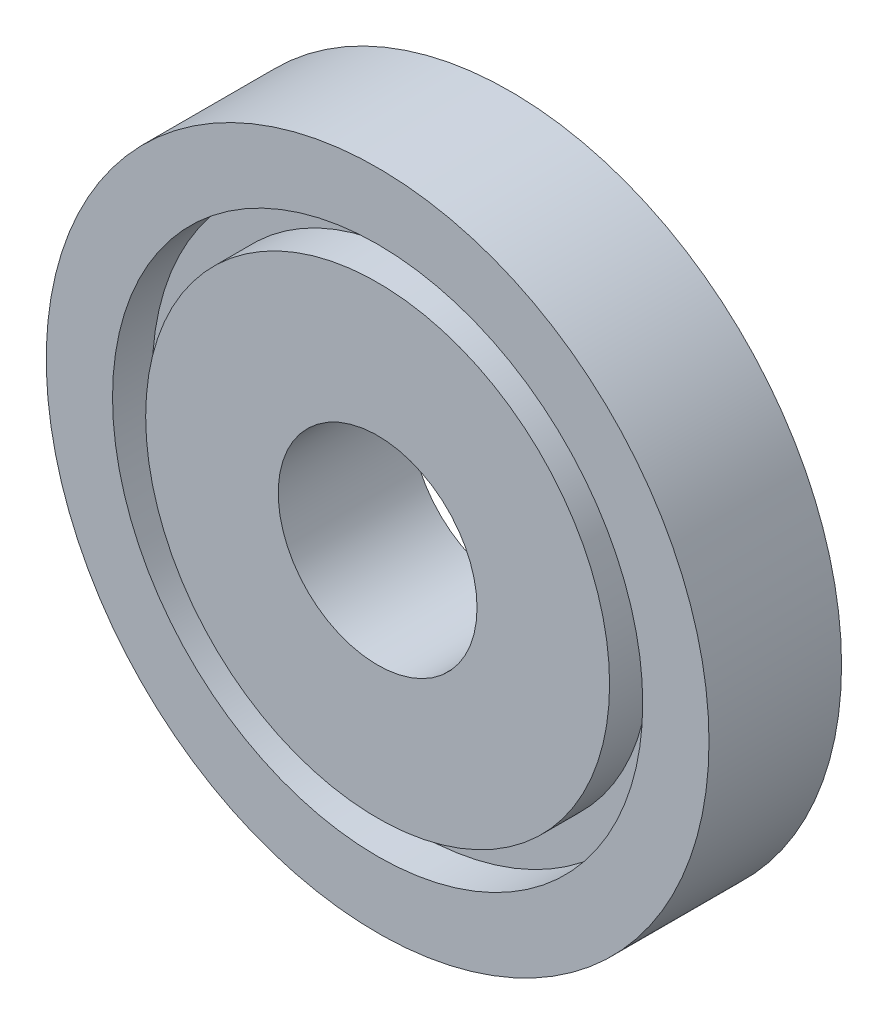
ISO-10303-21;
HEADER;
FILE_DESCRIPTION(('STEP AP214'),'2;1');
FILE_NAME('part.step','',(''),(''),'','','');
FILE_SCHEMA(('AUTOMOTIVE_DESIGN { 1 0 10303 214 1 1 1 1 }'));
ENDSEC;
DATA;
#1=APPLICATION_CONTEXT('core data for automotive mechanical design processes');
#2=APPLICATION_PROTOCOL_DEFINITION('international standard','automotive_design',2000,#1);
#3=PRODUCT_CONTEXT('',#1,'mechanical');
#4=PRODUCT('Part','Part','',(#3));
#5=PRODUCT_RELATED_PRODUCT_CATEGORY('part','',(#4));
#6=PRODUCT_DEFINITION_FORMATION('','',#4);
#7=PRODUCT_DEFINITION_CONTEXT('part definition',#1,'design');
#8=PRODUCT_DEFINITION('design','',#6,#7);
#9=PRODUCT_DEFINITION_SHAPE('','',#8);
#10=(LENGTH_UNIT() NAMED_UNIT(*) SI_UNIT(.MILLI.,.METRE.));
#11=(NAMED_UNIT(*) PLANE_ANGLE_UNIT() SI_UNIT($,.RADIAN.));
#12=(NAMED_UNIT(*) SI_UNIT($,.STERADIAN.) SOLID_ANGLE_UNIT());
#13=UNCERTAINTY_MEASURE_WITH_UNIT(LENGTH_MEASURE(1.E-05),#10,'distance_accuracy_value','');
#14=(GEOMETRIC_REPRESENTATION_CONTEXT(3) GLOBAL_UNCERTAINTY_ASSIGNED_CONTEXT((#13)) GLOBAL_UNIT_ASSIGNED_CONTEXT((#10,
#11,#12)) REPRESENTATION_CONTEXT('',''));
#15=CARTESIAN_POINT('',(0.,0.,0.));
#16=DIRECTION('',(0.,0.,1.));
#17=DIRECTION('',(1.,0.,0.));
#18=AXIS2_PLACEMENT_3D('',#15,#16,#17);
#19=CARTESIAN_POINT('',(0.,0.,-10.));
#20=DIRECTION('',(0.,0.,1.));
#21=DIRECTION('',(1.,0.,0.));
#22=AXIS2_PLACEMENT_3D('',#19,#20,#21);
#23=PLANE('',#22);
#24=CARTESIAN_POINT('',(0.,0.,-10.));
#25=DIRECTION('',(0.,0.,1.));
#26=DIRECTION('',(1.,0.,0.));
#27=AXIS2_PLACEMENT_3D('',#24,#25,#26);
#28=CIRCLE('',#27,15.);
#29=CARTESIAN_POINT('',(15.,0.,-10.));
#30=VERTEX_POINT('',#29);
#31=EDGE_CURVE('E46',#30,#30,#28,.T.);
#32=ORIENTED_EDGE('',*,*,#31,.T.);
#33=EDGE_LOOP('',(#32));
#34=FACE_BOUND('',#33,.T.);
#35=CARTESIAN_POINT('',(0.,0.,-10.));
#36=DIRECTION('',(0.,0.,1.));
#37=DIRECTION('',(1.,0.,0.));
#38=AXIS2_PLACEMENT_3D('',#35,#36,#37);
#39=CIRCLE('',#38,35.);
#40=CARTESIAN_POINT('',(35.,0.,-10.));
#41=VERTEX_POINT('',#40);
#42=EDGE_CURVE('E72',#41,#41,#39,.T.);
#43=ORIENTED_EDGE('',*,*,#42,.F.);
#44=EDGE_LOOP('',(#43));
#45=FACE_BOUND('',#44,.T.);
#46=ADVANCED_FACE('F35',(#34,#45),#23,.F.);
#47=CARTESIAN_POINT('',(0.,0.,10.));
#48=DIRECTION('',(0.,0.,1.));
#49=DIRECTION('',(1.,0.,0.));
#50=AXIS2_PLACEMENT_3D('',#47,#48,#49);
#51=PLANE('',#50);
#52=CARTESIAN_POINT('',(0.,0.,10.));
#53=DIRECTION('',(0.,0.,1.));
#54=DIRECTION('',(1.,0.,0.));
#55=AXIS2_PLACEMENT_3D('',#52,#53,#54);
#56=CIRCLE('',#55,15.);
#57=CARTESIAN_POINT('',(15.,0.,10.));
#58=VERTEX_POINT('',#57);
#59=EDGE_CURVE('E48',#58,#58,#56,.T.);
#60=ORIENTED_EDGE('',*,*,#59,.F.);
#61=EDGE_LOOP('',(#60));
#62=FACE_BOUND('',#61,.T.);
#63=CARTESIAN_POINT('',(0.,0.,10.));
#64=DIRECTION('',(0.,0.,1.));
#65=DIRECTION('',(1.,0.,0.));
#66=AXIS2_PLACEMENT_3D('',#63,#64,#65);
#67=CIRCLE('',#66,35.);
#68=CARTESIAN_POINT('',(35.,0.,10.));
#69=VERTEX_POINT('',#68);
#70=EDGE_CURVE('E60',#69,#69,#67,.T.);
#71=ORIENTED_EDGE('',*,*,#70,.T.);
#72=EDGE_LOOP('',(#71));
#73=FACE_BOUND('',#72,.T.);
#74=ADVANCED_FACE('F88',(#62,#73),#51,.T.);
#75=CARTESIAN_POINT('',(0.,0.,10.));
#76=DIRECTION('',(0.,0.,-1.));
#77=DIRECTION('',(-1.,0.,0.));
#78=AXIS2_PLACEMENT_3D('',#75,#76,#77);
#79=CYLINDRICAL_SURFACE('',#78,50.);
#80=CARTESIAN_POINT('',(0.,0.,10.));
#81=DIRECTION('',(0.,0.,1.));
#82=DIRECTION('',(1.,0.,0.));
#83=AXIS2_PLACEMENT_3D('',#80,#81,#82);
#84=CIRCLE('',#83,50.);
#85=CARTESIAN_POINT('',(50.,0.,10.));
#86=VERTEX_POINT('',#85);
#87=EDGE_CURVE('E10',#86,#86,#84,.T.);
#88=ORIENTED_EDGE('',*,*,#87,.F.);
#89=EDGE_LOOP('',(#88));
#90=FACE_BOUND('',#89,.T.);
#91=CARTESIAN_POINT('',(0.,0.,-10.));
#92=DIRECTION('',(0.,0.,1.));
#93=DIRECTION('',(1.,0.,0.));
#94=AXIS2_PLACEMENT_3D('',#91,#92,#93);
#95=CIRCLE('',#94,50.);
#96=CARTESIAN_POINT('',(50.,0.,-10.));
#97=VERTEX_POINT('',#96);
#98=EDGE_CURVE('E39',#97,#97,#95,.T.);
#99=ORIENTED_EDGE('',*,*,#98,.T.);
#100=EDGE_LOOP('',(#99));
#101=FACE_BOUND('',#100,.T.);
#102=ADVANCED_FACE('F37',(#90,#101),#79,.T.);
#103=CARTESIAN_POINT('',(0.,0.,10.));
#104=DIRECTION('',(0.,0.,1.));
#105=DIRECTION('',(1.,0.,0.));
#106=AXIS2_PLACEMENT_3D('',#103,#104,#105);
#107=CIRCLE('',#106,40.);
#108=CARTESIAN_POINT('',(40.,0.,10.));
#109=VERTEX_POINT('',#108);
#110=EDGE_CURVE('E54',#109,#109,#107,.T.);
#111=ORIENTED_EDGE('',*,*,#110,.F.);
#112=EDGE_LOOP('',(#111));
#113=FACE_BOUND('',#112,.T.);
#114=ORIENTED_EDGE('',*,*,#87,.T.);
#115=EDGE_LOOP('',(#114));
#116=FACE_BOUND('',#115,.T.);
#117=ADVANCED_FACE('F96',(#113,#116),#51,.T.);
#118=CARTESIAN_POINT('',(0.,0.,-10.));
#119=DIRECTION('',(0.,0.,1.));
#120=DIRECTION('',(1.,0.,0.));
#121=AXIS2_PLACEMENT_3D('',#118,#119,#120);
#122=CIRCLE('',#121,40.);
#123=CARTESIAN_POINT('',(40.,0.,-10.));
#124=VERTEX_POINT('',#123);
#125=EDGE_CURVE('E66',#124,#124,#122,.T.);
#126=ORIENTED_EDGE('',*,*,#125,.T.);
#127=EDGE_LOOP('',(#126));
#128=FACE_BOUND('',#127,.T.);
#129=ORIENTED_EDGE('',*,*,#98,.F.);
#130=EDGE_LOOP('',(#129));
#131=FACE_BOUND('',#130,.T.);
#132=ADVANCED_FACE('F90',(#128,#131),#23,.F.);
#133=CARTESIAN_POINT('',(0.,0.,-10.));
#134=DIRECTION('',(0.,0.,1.));
#135=DIRECTION('',(1.,0.,0.));
#136=AXIS2_PLACEMENT_3D('',#133,#134,#135);
#137=CYLINDRICAL_SURFACE('',#136,15.);
#138=ORIENTED_EDGE('',*,*,#31,.F.);
#139=EDGE_LOOP('',(#138));
#140=FACE_BOUND('',#139,.T.);
#141=ORIENTED_EDGE('',*,*,#59,.T.);
#142=EDGE_LOOP('',(#141));
#143=FACE_BOUND('',#142,.T.);
#144=ADVANCED_FACE('F98',(#140,#143),#137,.F.);
#145=CARTESIAN_POINT('',(0.,0.,4.));
#146=DIRECTION('',(0.,0.,1.));
#147=DIRECTION('',(1.,0.,0.));
#148=AXIS2_PLACEMENT_3D('',#145,#146,#147);
#149=CYLINDRICAL_SURFACE('',#148,40.);
#150=CARTESIAN_POINT('',(0.,0.,4.));
#151=DIRECTION('',(0.,0.,1.));
#152=DIRECTION('',(1.,0.,0.));
#153=AXIS2_PLACEMENT_3D('',#150,#151,#152);
#154=CIRCLE('',#153,40.);
#155=CARTESIAN_POINT('',(40.,0.,4.));
#156=VERTEX_POINT('',#155);
#157=EDGE_CURVE('E51',#156,#156,#154,.T.);
#158=ORIENTED_EDGE('',*,*,#157,.F.);
#159=EDGE_LOOP('',(#158));
#160=FACE_BOUND('',#159,.T.);
#161=ORIENTED_EDGE('',*,*,#110,.T.);
#162=EDGE_LOOP('',(#161));
#163=FACE_BOUND('',#162,.T.);
#164=ADVANCED_FACE('F104',(#160,#163),#149,.F.);
#165=CARTESIAN_POINT('',(0.,0.,4.));
#166=DIRECTION('',(0.,0.,1.));
#167=DIRECTION('',(1.,0.,0.));
#168=AXIS2_PLACEMENT_3D('',#165,#166,#167);
#169=PLANE('',#168);
#170=CARTESIAN_POINT('',(0.,0.,4.));
#171=DIRECTION('',(0.,0.,1.));
#172=DIRECTION('',(1.,0.,0.));
#173=AXIS2_PLACEMENT_3D('',#170,#171,#172);
#174=CIRCLE('',#173,35.);
#175=CARTESIAN_POINT('',(35.,0.,4.));
#176=VERTEX_POINT('',#175);
#177=EDGE_CURVE('E57',#176,#176,#174,.T.);
#178=ORIENTED_EDGE('',*,*,#177,.F.);
#179=EDGE_LOOP('',(#178));
#180=FACE_BOUND('',#179,.T.);
#181=ORIENTED_EDGE('',*,*,#157,.T.);
#182=EDGE_LOOP('',(#181));
#183=FACE_BOUND('',#182,.T.);
#184=ADVANCED_FACE('F136',(#180,#183),#169,.T.);
#185=CARTESIAN_POINT('',(0.,0.,4.));
#186=DIRECTION('',(0.,0.,1.));
#187=DIRECTION('',(1.,0.,0.));
#188=AXIS2_PLACEMENT_3D('',#185,#186,#187);
#189=CYLINDRICAL_SURFACE('',#188,35.);
#190=ORIENTED_EDGE('',*,*,#177,.T.);
#191=EDGE_LOOP('',(#190));
#192=FACE_BOUND('',#191,.T.);
#193=ORIENTED_EDGE('',*,*,#70,.F.);
#194=EDGE_LOOP('',(#193));
#195=FACE_BOUND('',#194,.T.);
#196=ADVANCED_FACE('F148',(#192,#195),#189,.T.);
#197=CARTESIAN_POINT('',(0.,0.,-4.));
#198=DIRECTION('',(0.,0.,-1.));
#199=DIRECTION('',(1.,0.,0.));
#200=AXIS2_PLACEMENT_3D('',#197,#198,#199);
#201=PLANE('',#200);
#202=CARTESIAN_POINT('',(0.,0.,-4.));
#203=DIRECTION('',(0.,0.,1.));
#204=DIRECTION('',(1.,0.,0.));
#205=AXIS2_PLACEMENT_3D('',#202,#203,#204);
#206=CIRCLE('',#205,40.);
#207=CARTESIAN_POINT('',(40.,0.,-4.));
#208=VERTEX_POINT('',#207);
#209=EDGE_CURVE('E63',#208,#208,#206,.T.);
#210=ORIENTED_EDGE('',*,*,#209,.F.);
#211=EDGE_LOOP('',(#210));
#212=FACE_BOUND('',#211,.T.);
#213=CARTESIAN_POINT('',(0.,0.,-4.));
#214=DIRECTION('',(0.,0.,1.));
#215=DIRECTION('',(1.,0.,0.));
#216=AXIS2_PLACEMENT_3D('',#213,#214,#215);
#217=CIRCLE('',#216,35.);
#218=CARTESIAN_POINT('',(35.,0.,-4.));
#219=VERTEX_POINT('',#218);
#220=EDGE_CURVE('E69',#219,#219,#217,.T.);
#221=ORIENTED_EDGE('',*,*,#220,.T.);
#222=EDGE_LOOP('',(#221));
#223=FACE_BOUND('',#222,.T.);
#224=ADVANCED_FACE('F78',(#212,#223),#201,.T.);
#225=CARTESIAN_POINT('',(0.,0.,-4.));
#226=DIRECTION('',(0.,0.,-1.));
#227=DIRECTION('',(-1.,0.,0.));
#228=AXIS2_PLACEMENT_3D('',#225,#226,#227);
#229=CYLINDRICAL_SURFACE('',#228,40.);
#230=ORIENTED_EDGE('',*,*,#209,.T.);
#231=EDGE_LOOP('',(#230));
#232=FACE_BOUND('',#231,.T.);
#233=ORIENTED_EDGE('',*,*,#125,.F.);
#234=EDGE_LOOP('',(#233));
#235=FACE_BOUND('',#234,.T.);
#236=ADVANCED_FACE('F83',(#232,#235),#229,.F.);
#237=CARTESIAN_POINT('',(0.,0.,-4.));
#238=DIRECTION('',(0.,0.,-1.));
#239=DIRECTION('',(-1.,0.,0.));
#240=AXIS2_PLACEMENT_3D('',#237,#238,#239);
#241=CYLINDRICAL_SURFACE('',#240,35.);
#242=ORIENTED_EDGE('',*,*,#220,.F.);
#243=EDGE_LOOP('',(#242));
#244=FACE_BOUND('',#243,.T.);
#245=ORIENTED_EDGE('',*,*,#42,.T.);
#246=EDGE_LOOP('',(#245));
#247=FACE_BOUND('',#246,.T.);
#248=ADVANCED_FACE('F80',(#244,#247),#241,.T.);
#249=CLOSED_SHELL('',(#46,#74,#102,#117,#132,#144,#164,#184,#196,#224,#236,#248));
#250=MANIFOLD_SOLID_BREP('B2',#249);
#251=ADVANCED_BREP_SHAPE_REPRESENTATION('',(#18,#250),#14);
#252=SHAPE_DEFINITION_REPRESENTATION(#9,#251);
ENDSEC;
END-ISO-10303-21;
